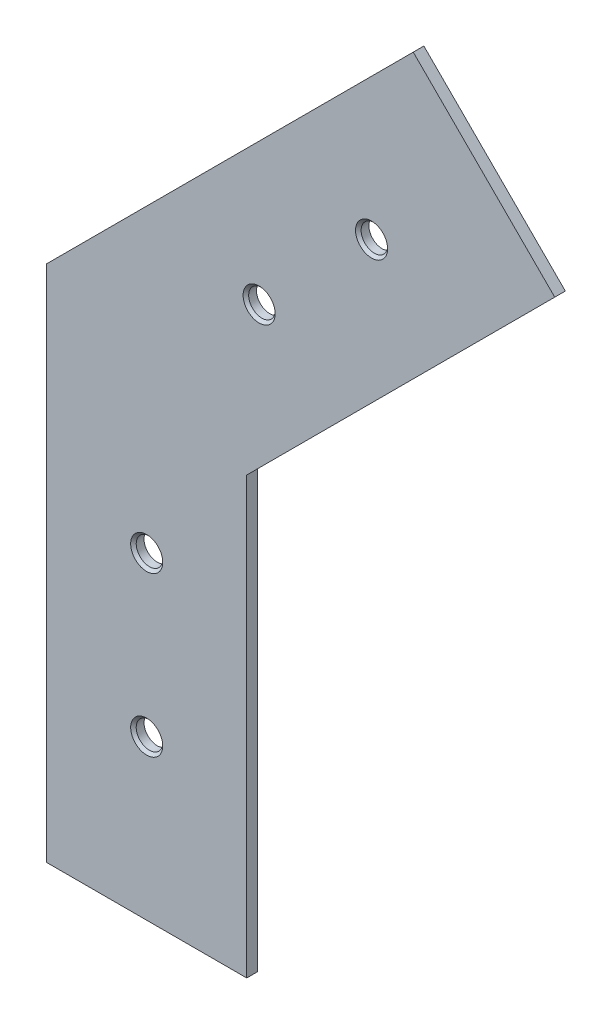
ISO-10303-21;
HEADER;
FILE_DESCRIPTION(('STEP AP214'),'2;1');
FILE_NAME('part.step','',(''),(''),'','','');
FILE_SCHEMA(('AUTOMOTIVE_DESIGN { 1 0 10303 214 1 1 1 1 }'));
ENDSEC;
DATA;
#1=APPLICATION_CONTEXT('core data for automotive mechanical design processes');
#2=APPLICATION_PROTOCOL_DEFINITION('international standard','automotive_design',2000,#1);
#3=PRODUCT_CONTEXT('',#1,'mechanical');
#4=PRODUCT('Part','Part','',(#3));
#5=PRODUCT_RELATED_PRODUCT_CATEGORY('part','',(#4));
#6=PRODUCT_DEFINITION_FORMATION('','',#4);
#7=PRODUCT_DEFINITION_CONTEXT('part definition',#1,'design');
#8=PRODUCT_DEFINITION('design','',#6,#7);
#9=PRODUCT_DEFINITION_SHAPE('','',#8);
#10=(LENGTH_UNIT() NAMED_UNIT(*) SI_UNIT(.MILLI.,.METRE.));
#11=(NAMED_UNIT(*) PLANE_ANGLE_UNIT() SI_UNIT($,.RADIAN.));
#12=(NAMED_UNIT(*) SI_UNIT($,.STERADIAN.) SOLID_ANGLE_UNIT());
#13=UNCERTAINTY_MEASURE_WITH_UNIT(LENGTH_MEASURE(1.E-05),#10,'distance_accuracy_value','');
#14=(GEOMETRIC_REPRESENTATION_CONTEXT(3) GLOBAL_UNCERTAINTY_ASSIGNED_CONTEXT((#13)) GLOBAL_UNIT_ASSIGNED_CONTEXT((#10,
#11,#12)) REPRESENTATION_CONTEXT('',''));
#15=CARTESIAN_POINT('',(0.,0.,0.));
#16=DIRECTION('',(0.,0.,1.));
#17=DIRECTION('',(1.,0.,0.));
#18=AXIS2_PLACEMENT_3D('',#15,#16,#17);
#19=CARTESIAN_POINT('',(-18.875,0.,-2.));
#20=DIRECTION('',(0.,-1.,0.));
#21=DIRECTION('',(0.,0.,-1.));
#22=AXIS2_PLACEMENT_3D('',#19,#20,#21);
#23=PLANE('',#22);
#24=DIRECTION('',(1.,0.,0.));
#25=VECTOR('',#24,1.);
#26=CARTESIAN_POINT('',(-18.875,0.,0.));
#27=LINE('',#26,#25);
#28=CARTESIAN_POINT('',(-18.875,0.,0.));
#29=VERTEX_POINT('',#28);
#30=CARTESIAN_POINT('',(18.875,0.,0.));
#31=VERTEX_POINT('',#30);
#32=EDGE_CURVE('E135',#29,#31,#27,.T.);
#33=ORIENTED_EDGE('',*,*,#32,.F.);
#34=DIRECTION('',(0.,0.,1.));
#35=VECTOR('',#34,1.);
#36=CARTESIAN_POINT('',(-18.875,0.,-2.));
#37=LINE('',#36,#35);
#38=CARTESIAN_POINT('',(-18.875,0.,-2.));
#39=VERTEX_POINT('',#38);
#40=EDGE_CURVE('E11',#39,#29,#37,.T.);
#41=ORIENTED_EDGE('',*,*,#40,.F.);
#42=DIRECTION('',(1.,0.,0.));
#43=VECTOR('',#42,1.);
#44=CARTESIAN_POINT('',(-18.875,0.,-2.));
#45=LINE('',#44,#43);
#46=CARTESIAN_POINT('',(18.875,0.,-2.));
#47=VERTEX_POINT('',#46);
#48=EDGE_CURVE('E150',#39,#47,#45,.T.);
#49=ORIENTED_EDGE('',*,*,#48,.T.);
#50=DIRECTION('',(0.,0.,1.));
#51=VECTOR('',#50,1.);
#52=CARTESIAN_POINT('',(18.875,0.,-2.));
#53=LINE('',#52,#51);
#54=EDGE_CURVE('E99',#47,#31,#53,.T.);
#55=ORIENTED_EDGE('',*,*,#54,.T.);
#56=EDGE_LOOP('',(#33,#41,#49,#55));
#57=FACE_BOUND('',#56,.T.);
#58=ADVANCED_FACE('F49',(#57),#23,.T.);
#59=CARTESIAN_POINT('',(-18.875,0.,-2.));
#60=DIRECTION('',(-1.,0.,0.));
#61=DIRECTION('',(0.,0.,1.));
#62=AXIS2_PLACEMENT_3D('',#59,#60,#61);
#63=PLANE('',#62);
#64=DIRECTION('',(0.,-1.,0.));
#65=VECTOR('',#64,1.);
#66=CARTESIAN_POINT('',(-18.875,0.,0.));
#67=LINE('',#66,#65);
#68=CARTESIAN_POINT('',(-18.875,97.8182809897922,0.));
#69=VERTEX_POINT('',#68);
#70=EDGE_CURVE('E148',#69,#29,#67,.T.);
#71=ORIENTED_EDGE('',*,*,#70,.F.);
#72=DIRECTION('',(0.,0.,1.));
#73=VECTOR('',#72,1.);
#74=CARTESIAN_POINT('',(-18.875,97.8182809897922,-2.));
#75=LINE('',#74,#73);
#76=CARTESIAN_POINT('',(-18.875,97.8182809897922,-2.));
#77=VERTEX_POINT('',#76);
#78=EDGE_CURVE('E58',#77,#69,#75,.T.);
#79=ORIENTED_EDGE('',*,*,#78,.F.);
#80=DIRECTION('',(0.,-1.,0.));
#81=VECTOR('',#80,1.);
#82=CARTESIAN_POINT('',(-18.875,0.,-2.));
#83=LINE('',#82,#81);
#84=EDGE_CURVE('E125',#77,#39,#83,.T.);
#85=ORIENTED_EDGE('',*,*,#84,.T.);
#86=ORIENTED_EDGE('',*,*,#40,.T.);
#87=EDGE_LOOP('',(#71,#79,#85,#86));
#88=FACE_BOUND('',#87,.T.);
#89=ADVANCED_FACE('F191',(#88),#63,.T.);
#90=CARTESIAN_POINT('',(-18.875,97.8182809897922,-2.));
#91=DIRECTION('',(-0.707106781186547,0.707106781186548,0.));
#92=DIRECTION('',(-0.707106781186548,-0.707106781186547,0.));
#93=AXIS2_PLACEMENT_3D('',#90,#91,#92);
#94=PLANE('',#93);
#95=DIRECTION('',(-0.707106781186548,-0.707106781186547,0.));
#96=VECTOR('',#95,1.);
#97=CARTESIAN_POINT('',(-18.875,97.8182809897922,0.));
#98=LINE('',#97,#96);
#99=CARTESIAN_POINT('',(50.2929698118932,166.986250801685,0.));
#100=VERTEX_POINT('',#99);
#101=EDGE_CURVE('E112',#100,#69,#98,.T.);
#102=ORIENTED_EDGE('',*,*,#101,.F.);
#103=DIRECTION('',(0.,0.,1.));
#104=VECTOR('',#103,1.);
#105=CARTESIAN_POINT('',(50.2929698118932,166.986250801685,-2.));
#106=LINE('',#105,#104);
#107=CARTESIAN_POINT('',(50.2929698118932,166.986250801685,-2.));
#108=VERTEX_POINT('',#107);
#109=EDGE_CURVE('E107',#108,#100,#106,.T.);
#110=ORIENTED_EDGE('',*,*,#109,.F.);
#111=DIRECTION('',(-0.707106781186548,-0.707106781186547,0.));
#112=VECTOR('',#111,1.);
#113=CARTESIAN_POINT('',(-18.875,97.8182809897922,-2.));
#114=LINE('',#113,#112);
#115=EDGE_CURVE('E110',#108,#77,#114,.T.);
#116=ORIENTED_EDGE('',*,*,#115,.T.);
#117=ORIENTED_EDGE('',*,*,#78,.T.);
#118=EDGE_LOOP('',(#102,#110,#116,#117));
#119=FACE_BOUND('',#118,.T.);
#120=ADVANCED_FACE('F109',(#119),#94,.T.);
#121=CARTESIAN_POINT('',(50.2929698118932,166.986250801685,-2.));
#122=DIRECTION('',(0.707106781186548,0.707106781186547,0.));
#123=DIRECTION('',(-0.707106781186547,0.707106781186548,0.));
#124=AXIS2_PLACEMENT_3D('',#121,#122,#123);
#125=PLANE('',#124);
#126=DIRECTION('',(-0.707106781186547,0.707106781186548,0.));
#127=VECTOR('',#126,1.);
#128=CARTESIAN_POINT('',(50.2929698118932,166.986250801685,0.));
#129=LINE('',#128,#127);
#130=CARTESIAN_POINT('',(76.9862508016853,140.292969811893,0.));
#131=VERTEX_POINT('',#130);
#132=EDGE_CURVE('E145',#131,#100,#129,.T.);
#133=ORIENTED_EDGE('',*,*,#132,.F.);
#134=DIRECTION('',(0.,0.,1.));
#135=VECTOR('',#134,1.);
#136=CARTESIAN_POINT('',(76.9862508016853,140.292969811893,-2.));
#137=LINE('',#136,#135);
#138=CARTESIAN_POINT('',(76.9862508016853,140.292969811893,-2.));
#139=VERTEX_POINT('',#138);
#140=EDGE_CURVE('E117',#139,#131,#137,.T.);
#141=ORIENTED_EDGE('',*,*,#140,.F.);
#142=DIRECTION('',(-0.707106781186547,0.707106781186548,0.));
#143=VECTOR('',#142,1.);
#144=CARTESIAN_POINT('',(50.2929698118932,166.986250801685,-2.));
#145=LINE('',#144,#143);
#146=EDGE_CURVE('E123',#139,#108,#145,.T.);
#147=ORIENTED_EDGE('',*,*,#146,.T.);
#148=ORIENTED_EDGE('',*,*,#109,.T.);
#149=EDGE_LOOP('',(#133,#141,#147,#148));
#150=FACE_BOUND('',#149,.T.);
#151=ADVANCED_FACE('F127',(#150),#125,.T.);
#152=CARTESIAN_POINT('',(18.875,82.1817190102078,-2.));
#153=DIRECTION('',(0.707106781186547,-0.707106781186547,0.));
#154=DIRECTION('',(0.707106781186548,0.707106781186548,0.));
#155=AXIS2_PLACEMENT_3D('',#152,#153,#154);
#156=PLANE('',#155);
#157=DIRECTION('',(0.707106781186548,0.707106781186548,0.));
#158=VECTOR('',#157,1.);
#159=CARTESIAN_POINT('',(18.875,82.1817190102078,0.));
#160=LINE('',#159,#158);
#161=CARTESIAN_POINT('',(18.875,82.1817190102078,0.));
#162=VERTEX_POINT('',#161);
#163=EDGE_CURVE('E142',#162,#131,#160,.T.);
#164=ORIENTED_EDGE('',*,*,#163,.F.);
#165=DIRECTION('',(0.,0.,1.));
#166=VECTOR('',#165,1.);
#167=CARTESIAN_POINT('',(18.875,82.1817190102078,-2.));
#168=LINE('',#167,#166);
#169=CARTESIAN_POINT('',(18.875,82.1817190102078,-2.));
#170=VERTEX_POINT('',#169);
#171=EDGE_CURVE('E154',#170,#162,#168,.T.);
#172=ORIENTED_EDGE('',*,*,#171,.F.);
#173=DIRECTION('',(0.707106781186548,0.707106781186548,0.));
#174=VECTOR('',#173,1.);
#175=CARTESIAN_POINT('',(18.875,82.1817190102078,-2.));
#176=LINE('',#175,#174);
#177=EDGE_CURVE('E128',#170,#139,#176,.T.);
#178=ORIENTED_EDGE('',*,*,#177,.T.);
#179=ORIENTED_EDGE('',*,*,#140,.T.);
#180=EDGE_LOOP('',(#164,#172,#178,#179));
#181=FACE_BOUND('',#180,.T.);
#182=ADVANCED_FACE('F204',(#181),#156,.T.);
#183=CARTESIAN_POINT('',(18.875,0.,-2.));
#184=DIRECTION('',(1.,0.,0.));
#185=DIRECTION('',(0.,0.,-1.));
#186=AXIS2_PLACEMENT_3D('',#183,#184,#185);
#187=PLANE('',#186);
#188=DIRECTION('',(0.,1.,0.));
#189=VECTOR('',#188,1.);
#190=CARTESIAN_POINT('',(18.875,0.,0.));
#191=LINE('',#190,#189);
#192=EDGE_CURVE('E138',#31,#162,#191,.T.);
#193=ORIENTED_EDGE('',*,*,#192,.F.);
#194=ORIENTED_EDGE('',*,*,#54,.F.);
#195=DIRECTION('',(0.,1.,0.));
#196=VECTOR('',#195,1.);
#197=CARTESIAN_POINT('',(18.875,0.,-2.));
#198=LINE('',#197,#196);
#199=EDGE_CURVE('E130',#47,#170,#198,.T.);
#200=ORIENTED_EDGE('',*,*,#199,.T.);
#201=ORIENTED_EDGE('',*,*,#171,.T.);
#202=EDGE_LOOP('',(#193,#194,#200,#201));
#203=FACE_BOUND('',#202,.T.);
#204=ADVANCED_FACE('F187',(#203),#187,.T.);
#205=CARTESIAN_POINT('',(0.,0.,-2.));
#206=DIRECTION('',(0.,0.,1.));
#207=DIRECTION('',(1.,0.,0.));
#208=AXIS2_PLACEMENT_3D('',#205,#206,#207);
#209=PLANE('',#208);
#210=CARTESIAN_POINT('',(42.4264068711928,132.426406871193,-2.));
#211=DIRECTION('',(0.,0.,1.));
#212=DIRECTION('',(1.,0.,0.));
#213=AXIS2_PLACEMENT_3D('',#210,#211,#212);
#214=CIRCLE('',#213,2.49999999999999);
#215=CARTESIAN_POINT('',(44.9264068711928,132.426406871193,-2.));
#216=VERTEX_POINT('',#215);
#217=EDGE_CURVE('E52',#216,#216,#214,.T.);
#218=ORIENTED_EDGE('',*,*,#217,.T.);
#219=EDGE_LOOP('',(#218));
#220=FACE_BOUND('',#219,.T.);
#221=CARTESIAN_POINT('',(21.2132034355964,111.213203435596,-2.));
#222=DIRECTION('',(0.,0.,1.));
#223=DIRECTION('',(1.,0.,0.));
#224=AXIS2_PLACEMENT_3D('',#221,#222,#223);
#225=CIRCLE('',#224,2.49999999999999);
#226=CARTESIAN_POINT('',(23.7132034355964,111.213203435596,-2.));
#227=VERTEX_POINT('',#226);
#228=EDGE_CURVE('E164',#227,#227,#225,.T.);
#229=ORIENTED_EDGE('',*,*,#228,.T.);
#230=EDGE_LOOP('',(#229));
#231=FACE_BOUND('',#230,.T.);
#232=CARTESIAN_POINT('',(0.,60.,-2.));
#233=DIRECTION('',(0.,0.,1.));
#234=DIRECTION('',(1.,0.,0.));
#235=AXIS2_PLACEMENT_3D('',#232,#233,#234);
#236=CIRCLE('',#235,2.49999999999999);
#237=CARTESIAN_POINT('',(2.49999999999999,60.,-2.));
#238=VERTEX_POINT('',#237);
#239=EDGE_CURVE('E160',#238,#238,#236,.T.);
#240=ORIENTED_EDGE('',*,*,#239,.T.);
#241=EDGE_LOOP('',(#240));
#242=FACE_BOUND('',#241,.T.);
#243=CARTESIAN_POINT('',(0.,30.,-2.));
#244=DIRECTION('',(0.,0.,1.));
#245=DIRECTION('',(1.,0.,0.));
#246=AXIS2_PLACEMENT_3D('',#243,#244,#245);
#247=CIRCLE('',#246,2.49999999999999);
#248=CARTESIAN_POINT('',(2.49999999999999,30.,-2.));
#249=VERTEX_POINT('',#248);
#250=EDGE_CURVE('E139',#249,#249,#247,.T.);
#251=ORIENTED_EDGE('',*,*,#250,.T.);
#252=EDGE_LOOP('',(#251));
#253=FACE_BOUND('',#252,.T.);
#254=ORIENTED_EDGE('',*,*,#48,.F.);
#255=ORIENTED_EDGE('',*,*,#84,.F.);
#256=ORIENTED_EDGE('',*,*,#115,.F.);
#257=ORIENTED_EDGE('',*,*,#146,.F.);
#258=ORIENTED_EDGE('',*,*,#177,.F.);
#259=ORIENTED_EDGE('',*,*,#199,.F.);
#260=EDGE_LOOP('',(#254,#255,#256,#257,#258,#259));
#261=FACE_BOUND('',#260,.T.);
#262=ADVANCED_FACE('F121',(#220,#231,#242,#253,#261),#209,.F.);
#263=CARTESIAN_POINT('',(0.,0.,0.));
#264=DIRECTION('',(0.,0.,1.));
#265=DIRECTION('',(1.,0.,0.));
#266=AXIS2_PLACEMENT_3D('',#263,#264,#265);
#267=PLANE('',#266);
#268=CARTESIAN_POINT('',(42.4264068711928,132.426406871193,0.));
#269=DIRECTION('',(0.,0.,1.));
#270=DIRECTION('',(1.,0.,0.));
#271=AXIS2_PLACEMENT_3D('',#268,#269,#270);
#272=CIRCLE('',#271,3.025);
#273=CARTESIAN_POINT('',(45.4514068711928,132.426406871193,0.));
#274=VERTEX_POINT('',#273);
#275=EDGE_CURVE('E258',#274,#274,#272,.T.);
#276=ORIENTED_EDGE('',*,*,#275,.F.);
#277=EDGE_LOOP('',(#276));
#278=FACE_BOUND('',#277,.T.);
#279=CARTESIAN_POINT('',(21.2132034355964,111.213203435596,0.));
#280=DIRECTION('',(0.,0.,1.));
#281=DIRECTION('',(1.,0.,0.));
#282=AXIS2_PLACEMENT_3D('',#279,#280,#281);
#283=CIRCLE('',#282,3.025);
#284=CARTESIAN_POINT('',(24.2382034355964,111.213203435596,0.));
#285=VERTEX_POINT('',#284);
#286=EDGE_CURVE('E173',#285,#285,#283,.T.);
#287=ORIENTED_EDGE('',*,*,#286,.F.);
#288=EDGE_LOOP('',(#287));
#289=FACE_BOUND('',#288,.T.);
#290=CARTESIAN_POINT('',(0.,60.,0.));
#291=DIRECTION('',(0.,0.,1.));
#292=DIRECTION('',(1.,0.,0.));
#293=AXIS2_PLACEMENT_3D('',#290,#291,#292);
#294=CIRCLE('',#293,3.025);
#295=CARTESIAN_POINT('',(3.025,60.,0.));
#296=VERTEX_POINT('',#295);
#297=EDGE_CURVE('E166',#296,#296,#294,.T.);
#298=ORIENTED_EDGE('',*,*,#297,.F.);
#299=EDGE_LOOP('',(#298));
#300=FACE_BOUND('',#299,.T.);
#301=CARTESIAN_POINT('',(0.,30.,0.));
#302=DIRECTION('',(0.,0.,1.));
#303=DIRECTION('',(1.,0.,0.));
#304=AXIS2_PLACEMENT_3D('',#301,#302,#303);
#305=CIRCLE('',#304,3.025);
#306=CARTESIAN_POINT('',(3.025,30.,0.));
#307=VERTEX_POINT('',#306);
#308=EDGE_CURVE('E162',#307,#307,#305,.T.);
#309=ORIENTED_EDGE('',*,*,#308,.F.);
#310=EDGE_LOOP('',(#309));
#311=FACE_BOUND('',#310,.T.);
#312=ORIENTED_EDGE('',*,*,#32,.T.);
#313=ORIENTED_EDGE('',*,*,#192,.T.);
#314=ORIENTED_EDGE('',*,*,#163,.T.);
#315=ORIENTED_EDGE('',*,*,#132,.T.);
#316=ORIENTED_EDGE('',*,*,#101,.T.);
#317=ORIENTED_EDGE('',*,*,#70,.T.);
#318=EDGE_LOOP('',(#312,#313,#314,#315,#316,#317));
#319=FACE_BOUND('',#318,.T.);
#320=ADVANCED_FACE('F190',(#278,#289,#300,#311,#319),#267,.T.);
#321=CARTESIAN_POINT('',(0.,30.,0.));
#322=DIRECTION('',(0.,0.,1.));
#323=DIRECTION('',(1.,0.,0.));
#324=AXIS2_PLACEMENT_3D('',#321,#322,#323);
#325=CYLINDRICAL_SURFACE('',#324,2.49999999999999);
#326=CARTESIAN_POINT('',(0.,30.,-0.525000000000003));
#327=DIRECTION('',(0.,0.,1.));
#328=DIRECTION('',(1.,0.,0.));
#329=AXIS2_PLACEMENT_3D('',#326,#327,#328);
#330=CIRCLE('',#329,2.5);
#331=CARTESIAN_POINT('',(2.5,30.,-0.525000000000003));
#332=VERTEX_POINT('',#331);
#333=EDGE_CURVE('E159',#332,#332,#330,.T.);
#334=ORIENTED_EDGE('',*,*,#333,.T.);
#335=EDGE_LOOP('',(#334));
#336=FACE_BOUND('',#335,.T.);
#337=ORIENTED_EDGE('',*,*,#250,.F.);
#338=EDGE_LOOP('',(#337));
#339=FACE_BOUND('',#338,.T.);
#340=ADVANCED_FACE('F216',(#336,#339),#325,.F.);
#341=CARTESIAN_POINT('',(0.,30.,0.));
#342=DIRECTION('',(0.,0.,1.));
#343=DIRECTION('',(1.,0.,0.));
#344=AXIS2_PLACEMENT_3D('',#341,#342,#343);
#345=CONICAL_SURFACE('',#344,3.025,0.785398163397445);
#346=ORIENTED_EDGE('',*,*,#333,.F.);
#347=EDGE_LOOP('',(#346));
#348=FACE_BOUND('',#347,.T.);
#349=ORIENTED_EDGE('',*,*,#308,.T.);
#350=EDGE_LOOP('',(#349));
#351=FACE_BOUND('',#350,.T.);
#352=ADVANCED_FACE('F222',(#348,#351),#345,.F.);
#353=CARTESIAN_POINT('',(0.,60.,0.));
#354=DIRECTION('',(0.,0.,1.));
#355=DIRECTION('',(1.,0.,0.));
#356=AXIS2_PLACEMENT_3D('',#353,#354,#355);
#357=CYLINDRICAL_SURFACE('',#356,2.49999999999999);
#358=CARTESIAN_POINT('',(0.,60.,-0.525000000000003));
#359=DIRECTION('',(0.,0.,1.));
#360=DIRECTION('',(1.,0.,0.));
#361=AXIS2_PLACEMENT_3D('',#358,#359,#360);
#362=CIRCLE('',#361,2.5);
#363=CARTESIAN_POINT('',(2.5,60.,-0.525000000000003));
#364=VERTEX_POINT('',#363);
#365=EDGE_CURVE('E163',#364,#364,#362,.T.);
#366=ORIENTED_EDGE('',*,*,#365,.T.);
#367=EDGE_LOOP('',(#366));
#368=FACE_BOUND('',#367,.T.);
#369=ORIENTED_EDGE('',*,*,#239,.F.);
#370=EDGE_LOOP('',(#369));
#371=FACE_BOUND('',#370,.T.);
#372=ADVANCED_FACE('F226',(#368,#371),#357,.F.);
#373=CARTESIAN_POINT('',(0.,60.,0.));
#374=DIRECTION('',(0.,0.,1.));
#375=DIRECTION('',(1.,0.,0.));
#376=AXIS2_PLACEMENT_3D('',#373,#374,#375);
#377=CONICAL_SURFACE('',#376,3.025,0.785398163397445);
#378=ORIENTED_EDGE('',*,*,#365,.F.);
#379=EDGE_LOOP('',(#378));
#380=FACE_BOUND('',#379,.T.);
#381=ORIENTED_EDGE('',*,*,#297,.T.);
#382=EDGE_LOOP('',(#381));
#383=FACE_BOUND('',#382,.T.);
#384=ADVANCED_FACE('F230',(#380,#383),#377,.F.);
#385=CARTESIAN_POINT('',(21.2132034355964,111.213203435596,0.));
#386=DIRECTION('',(0.,0.,1.));
#387=DIRECTION('',(1.,0.,0.));
#388=AXIS2_PLACEMENT_3D('',#385,#386,#387);
#389=CYLINDRICAL_SURFACE('',#388,2.49999999999999);
#390=CARTESIAN_POINT('',(21.2132034355964,111.213203435596,-0.525000000000003));
#391=DIRECTION('',(0.,0.,1.));
#392=DIRECTION('',(1.,0.,0.));
#393=AXIS2_PLACEMENT_3D('',#390,#391,#392);
#394=CIRCLE('',#393,2.5);
#395=CARTESIAN_POINT('',(23.7132034355964,111.213203435596,-0.525000000000003));
#396=VERTEX_POINT('',#395);
#397=EDGE_CURVE('E167',#396,#396,#394,.T.);
#398=ORIENTED_EDGE('',*,*,#397,.T.);
#399=EDGE_LOOP('',(#398));
#400=FACE_BOUND('',#399,.T.);
#401=ORIENTED_EDGE('',*,*,#228,.F.);
#402=EDGE_LOOP('',(#401));
#403=FACE_BOUND('',#402,.T.);
#404=ADVANCED_FACE('F234',(#400,#403),#389,.F.);
#405=CARTESIAN_POINT('',(21.2132034355964,111.213203435596,0.));
#406=DIRECTION('',(0.,0.,1.));
#407=DIRECTION('',(1.,0.,0.));
#408=AXIS2_PLACEMENT_3D('',#405,#406,#407);
#409=CONICAL_SURFACE('',#408,3.025,0.785398163397445);
#410=ORIENTED_EDGE('',*,*,#397,.F.);
#411=EDGE_LOOP('',(#410));
#412=FACE_BOUND('',#411,.T.);
#413=ORIENTED_EDGE('',*,*,#286,.T.);
#414=EDGE_LOOP('',(#413));
#415=FACE_BOUND('',#414,.T.);
#416=ADVANCED_FACE('F238',(#412,#415),#409,.F.);
#417=CARTESIAN_POINT('',(42.4264068711928,132.426406871193,0.));
#418=DIRECTION('',(0.,0.,1.));
#419=DIRECTION('',(1.,0.,0.));
#420=AXIS2_PLACEMENT_3D('',#417,#418,#419);
#421=CYLINDRICAL_SURFACE('',#420,2.49999999999999);
#422=CARTESIAN_POINT('',(42.4264068711928,132.426406871193,-0.525000000000003));
#423=DIRECTION('',(0.,0.,1.));
#424=DIRECTION('',(1.,0.,0.));
#425=AXIS2_PLACEMENT_3D('',#422,#423,#424);
#426=CIRCLE('',#425,2.5);
#427=CARTESIAN_POINT('',(44.9264068711928,132.426406871193,-0.525000000000003));
#428=VERTEX_POINT('',#427);
#429=EDGE_CURVE('E255',#428,#428,#426,.T.);
#430=ORIENTED_EDGE('',*,*,#429,.T.);
#431=EDGE_LOOP('',(#430));
#432=FACE_BOUND('',#431,.T.);
#433=ORIENTED_EDGE('',*,*,#217,.F.);
#434=EDGE_LOOP('',(#433));
#435=FACE_BOUND('',#434,.T.);
#436=ADVANCED_FACE('F241',(#432,#435),#421,.F.);
#437=CARTESIAN_POINT('',(42.4264068711928,132.426406871193,0.));
#438=DIRECTION('',(0.,0.,1.));
#439=DIRECTION('',(1.,0.,0.));
#440=AXIS2_PLACEMENT_3D('',#437,#438,#439);
#441=CONICAL_SURFACE('',#440,3.025,0.785398163397448);
#442=ORIENTED_EDGE('',*,*,#429,.F.);
#443=EDGE_LOOP('',(#442));
#444=FACE_BOUND('',#443,.T.);
#445=ORIENTED_EDGE('',*,*,#275,.T.);
#446=EDGE_LOOP('',(#445));
#447=FACE_BOUND('',#446,.T.);
#448=ADVANCED_FACE('F245',(#444,#447),#441,.F.);
#449=CLOSED_SHELL('',(#58,#89,#120,#151,#182,#204,#262,#320,#340,#352,#372,#384,#404,#416,#436,#448));
#450=MANIFOLD_SOLID_BREP('B2',#449);
#451=ADVANCED_BREP_SHAPE_REPRESENTATION('',(#18,#450),#14);
#452=SHAPE_DEFINITION_REPRESENTATION(#9,#451);
ENDSEC;
END-ISO-10303-21;
